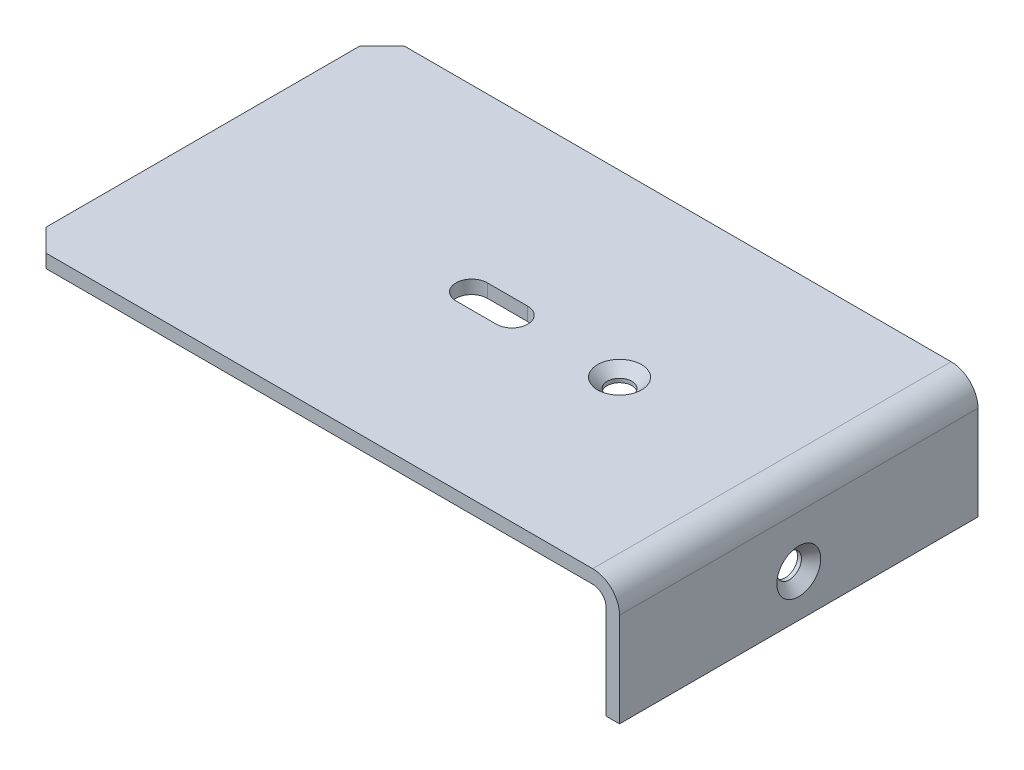
ISO-10303-21;
HEADER;
FILE_DESCRIPTION(('STEP AP214'),'2;1');
FILE_NAME('part.step','',(''),(''),'','','');
FILE_SCHEMA(('AUTOMOTIVE_DESIGN { 1 0 10303 214 1 1 1 1 }'));
ENDSEC;
DATA;
#1=APPLICATION_CONTEXT('core data for automotive mechanical design processes');
#2=APPLICATION_PROTOCOL_DEFINITION('international standard','automotive_design',2000,#1);
#3=PRODUCT_CONTEXT('',#1,'mechanical');
#4=PRODUCT('Part','Part','',(#3));
#5=PRODUCT_RELATED_PRODUCT_CATEGORY('part','',(#4));
#6=PRODUCT_DEFINITION_FORMATION('','',#4);
#7=PRODUCT_DEFINITION_CONTEXT('part definition',#1,'design');
#8=PRODUCT_DEFINITION('design','',#6,#7);
#9=PRODUCT_DEFINITION_SHAPE('','',#8);
#10=(LENGTH_UNIT() NAMED_UNIT(*) SI_UNIT(.MILLI.,.METRE.));
#11=(NAMED_UNIT(*) PLANE_ANGLE_UNIT() SI_UNIT($,.RADIAN.));
#12=(NAMED_UNIT(*) SI_UNIT($,.STERADIAN.) SOLID_ANGLE_UNIT());
#13=UNCERTAINTY_MEASURE_WITH_UNIT(LENGTH_MEASURE(1.E-05),#10,'distance_accuracy_value','');
#14=(GEOMETRIC_REPRESENTATION_CONTEXT(3) GLOBAL_UNCERTAINTY_ASSIGNED_CONTEXT((#13)) GLOBAL_UNIT_ASSIGNED_CONTEXT((#10,
#11,#12)) REPRESENTATION_CONTEXT('',''));
#15=CARTESIAN_POINT('',(0.,0.,0.));
#16=DIRECTION('',(0.,0.,1.));
#17=DIRECTION('',(1.,0.,0.));
#18=AXIS2_PLACEMENT_3D('',#15,#16,#17);
#19=CARTESIAN_POINT('',(0.,-3.00000000000002,40.));
#20=DIRECTION('',(1.,0.,0.));
#21=DIRECTION('',(0.,1.,0.));
#22=AXIS2_PLACEMENT_3D('',#19,#20,#21);
#23=PLANE('',#22);
#24=CARTESIAN_POINT('',(0.,-14.5,0.));
#25=DIRECTION('',(1.,0.,0.));
#26=DIRECTION('',(0.,1.,0.));
#27=AXIS2_PLACEMENT_3D('',#24,#25,#26);
#28=CIRCLE('',#27,2.75);
#29=CARTESIAN_POINT('',(0.,-11.75,0.));
#30=VERTEX_POINT('',#29);
#31=EDGE_CURVE('E253',#30,#30,#28,.T.);
#32=ORIENTED_EDGE('',*,*,#31,.T.);
#33=EDGE_LOOP('',(#32));
#34=FACE_BOUND('',#33,.T.);
#35=DIRECTION('',(0.,-1.,0.));
#36=VECTOR('',#35,1.);
#37=CARTESIAN_POINT('',(0.,-3.00000000000002,-40.));
#38=LINE('',#37,#36);
#39=CARTESIAN_POINT('',(0.,-3.00000000000002,-40.));
#40=VERTEX_POINT('',#39);
#41=CARTESIAN_POINT('',(0.,-24.,-40.));
#42=VERTEX_POINT('',#41);
#43=EDGE_CURVE('E164',#40,#42,#38,.T.);
#44=ORIENTED_EDGE('',*,*,#43,.T.);
#45=DIRECTION('',(0.,0.,-1.));
#46=VECTOR('',#45,1.);
#47=CARTESIAN_POINT('',(0.,-24.,40.));
#48=LINE('',#47,#46);
#49=CARTESIAN_POINT('',(0.,-24.,40.));
#50=VERTEX_POINT('',#49);
#51=EDGE_CURVE('E220',#50,#42,#48,.T.);
#52=ORIENTED_EDGE('',*,*,#51,.F.);
#53=DIRECTION('',(0.,-1.,0.));
#54=VECTOR('',#53,1.);
#55=CARTESIAN_POINT('',(0.,-3.00000000000002,40.));
#56=LINE('',#55,#54);
#57=CARTESIAN_POINT('',(0.,-3.00000000000002,40.));
#58=VERTEX_POINT('',#57);
#59=EDGE_CURVE('E167',#58,#50,#56,.T.);
#60=ORIENTED_EDGE('',*,*,#59,.F.);
#61=DIRECTION('',(0.,0.,-1.));
#62=VECTOR('',#61,1.);
#63=CARTESIAN_POINT('',(0.,-3.00000000000002,40.));
#64=LINE('',#63,#62);
#65=EDGE_CURVE('E185',#58,#40,#64,.T.);
#66=ORIENTED_EDGE('',*,*,#65,.T.);
#67=EDGE_LOOP('',(#44,#52,#60,#66));
#68=FACE_BOUND('',#67,.T.);
#69=ADVANCED_FACE('F37',(#34,#68),#23,.F.);
#70=CARTESIAN_POINT('',(3.,-24.,40.));
#71=DIRECTION('',(0.,-1.,0.));
#72=DIRECTION('',(0.,0.,-1.));
#73=AXIS2_PLACEMENT_3D('',#70,#71,#72);
#74=PLANE('',#73);
#75=DIRECTION('',(-1.,0.,0.));
#76=VECTOR('',#75,1.);
#77=CARTESIAN_POINT('',(3.,-24.,-40.));
#78=LINE('',#77,#76);
#79=CARTESIAN_POINT('',(3.,-24.,-40.));
#80=VERTEX_POINT('',#79);
#81=EDGE_CURVE('E188',#80,#42,#78,.T.);
#82=ORIENTED_EDGE('',*,*,#81,.F.);
#83=DIRECTION('',(0.,0.,-1.));
#84=VECTOR('',#83,1.);
#85=CARTESIAN_POINT('',(3.,-24.,40.));
#86=LINE('',#85,#84);
#87=CARTESIAN_POINT('',(3.,-24.,40.));
#88=VERTEX_POINT('',#87);
#89=EDGE_CURVE('E218',#88,#80,#86,.T.);
#90=ORIENTED_EDGE('',*,*,#89,.F.);
#91=DIRECTION('',(-1.,0.,0.));
#92=VECTOR('',#91,1.);
#93=CARTESIAN_POINT('',(3.,-24.,40.));
#94=LINE('',#93,#92);
#95=EDGE_CURVE('E169',#88,#50,#94,.T.);
#96=ORIENTED_EDGE('',*,*,#95,.T.);
#97=ORIENTED_EDGE('',*,*,#51,.T.);
#98=EDGE_LOOP('',(#82,#90,#96,#97));
#99=FACE_BOUND('',#98,.T.);
#100=ADVANCED_FACE('F274',(#99),#74,.T.);
#101=CARTESIAN_POINT('',(3.,-3.00000000000002,40.));
#102=DIRECTION('',(1.,0.,0.));
#103=DIRECTION('',(0.,1.,0.));
#104=AXIS2_PLACEMENT_3D('',#101,#102,#103);
#105=PLANE('',#104);
#106=CARTESIAN_POINT('',(3.,-14.5,0.));
#107=DIRECTION('',(1.,0.,0.));
#108=DIRECTION('',(0.,1.,0.));
#109=AXIS2_PLACEMENT_3D('',#106,#107,#108);
#110=CIRCLE('',#109,4.90000000000002);
#111=CARTESIAN_POINT('',(3.,-9.59999999999999,0.));
#112=VERTEX_POINT('',#111);
#113=EDGE_CURVE('E256',#112,#112,#110,.F.);
#114=ORIENTED_EDGE('',*,*,#113,.T.);
#115=EDGE_LOOP('',(#114));
#116=FACE_BOUND('',#115,.T.);
#117=DIRECTION('',(0.,-1.,0.));
#118=VECTOR('',#117,1.);
#119=CARTESIAN_POINT('',(3.,-3.00000000000002,-40.));
#120=LINE('',#119,#118);
#121=CARTESIAN_POINT('',(3.,-3.00000000000002,-40.));
#122=VERTEX_POINT('',#121);
#123=EDGE_CURVE('E191',#122,#80,#120,.T.);
#124=ORIENTED_EDGE('',*,*,#123,.F.);
#125=DIRECTION('',(0.,0.,-1.));
#126=VECTOR('',#125,1.);
#127=CARTESIAN_POINT('',(3.,-3.00000000000002,40.));
#128=LINE('',#127,#126);
#129=CARTESIAN_POINT('',(3.,-3.00000000000002,40.));
#130=VERTEX_POINT('',#129);
#131=EDGE_CURVE('E216',#130,#122,#128,.T.);
#132=ORIENTED_EDGE('',*,*,#131,.F.);
#133=DIRECTION('',(0.,-1.,0.));
#134=VECTOR('',#133,1.);
#135=CARTESIAN_POINT('',(3.,-3.00000000000002,40.));
#136=LINE('',#135,#134);
#137=EDGE_CURVE('E173',#130,#88,#136,.T.);
#138=ORIENTED_EDGE('',*,*,#137,.T.);
#139=ORIENTED_EDGE('',*,*,#89,.T.);
#140=EDGE_LOOP('',(#124,#132,#138,#139));
#141=FACE_BOUND('',#140,.T.);
#142=ADVANCED_FACE('F280',(#116,#141),#105,.T.);
#143=CARTESIAN_POINT('',(-3.,-3.,40.));
#144=DIRECTION('',(0.,0.,-1.));
#145=DIRECTION('',(-1.,0.,0.));
#146=AXIS2_PLACEMENT_3D('',#143,#144,#145);
#147=CYLINDRICAL_SURFACE('',#146,6.);
#148=CARTESIAN_POINT('',(-3.,-3.,-40.));
#149=DIRECTION('',(0.,0.,1.));
#150=DIRECTION('',(1.,0.,0.));
#151=AXIS2_PLACEMENT_3D('',#148,#149,#150);
#152=CIRCLE('',#151,6.);
#153=CARTESIAN_POINT('',(-3.00000000000004,3.,-40.));
#154=VERTEX_POINT('',#153);
#155=EDGE_CURVE('E194',#154,#122,#152,.F.);
#156=ORIENTED_EDGE('',*,*,#155,.F.);
#157=DIRECTION('',(0.,0.,-1.));
#158=VECTOR('',#157,1.);
#159=CARTESIAN_POINT('',(-3.00000000000004,3.,40.));
#160=LINE('',#159,#158);
#161=CARTESIAN_POINT('',(-3.00000000000004,3.,40.));
#162=VERTEX_POINT('',#161);
#163=EDGE_CURVE('E213',#162,#154,#160,.T.);
#164=ORIENTED_EDGE('',*,*,#163,.F.);
#165=CARTESIAN_POINT('',(-3.,-3.,40.));
#166=DIRECTION('',(0.,0.,1.));
#167=DIRECTION('',(1.,0.,0.));
#168=AXIS2_PLACEMENT_3D('',#165,#166,#167);
#169=CIRCLE('',#168,6.);
#170=EDGE_CURVE('E176',#162,#130,#169,.F.);
#171=ORIENTED_EDGE('',*,*,#170,.T.);
#172=ORIENTED_EDGE('',*,*,#131,.T.);
#173=EDGE_LOOP('',(#156,#164,#171,#172));
#174=FACE_BOUND('',#173,.T.);
#175=ADVANCED_FACE('F335',(#174),#147,.T.);
#176=CARTESIAN_POINT('',(-3.00000000000002,3.,40.));
#177=DIRECTION('',(0.,1.,0.));
#178=DIRECTION('',(-1.,0.,0.));
#179=AXIS2_PLACEMENT_3D('',#176,#177,#178);
#180=PLANE('',#179);
#181=CARTESIAN_POINT('',(-37.,3.,0.));
#182=DIRECTION('',(0.,1.,0.));
#183=DIRECTION('',(-1.,0.,0.));
#184=AXIS2_PLACEMENT_3D('',#181,#182,#183);
#185=CIRCLE('',#184,4.90000000000002);
#186=CARTESIAN_POINT('',(-41.9,2.99999999999999,0.));
#187=VERTEX_POINT('',#186);
#188=EDGE_CURVE('E11',#187,#187,#185,.F.);
#189=ORIENTED_EDGE('',*,*,#188,.T.);
#190=EDGE_LOOP('',(#189));
#191=FACE_BOUND('',#190,.T.);
#192=CARTESIAN_POINT('',(-70.,2.99999999999999,0.));
#193=DIRECTION('',(0.,1.,0.));
#194=DIRECTION('',(-1.,0.,0.));
#195=AXIS2_PLACEMENT_3D('',#192,#193,#194);
#196=CIRCLE('',#195,3.5);
#197=CARTESIAN_POINT('',(-70.,2.99999999999999,-3.50000000000003));
#198=VERTEX_POINT('',#197);
#199=CARTESIAN_POINT('',(-70.,2.99999999999999,3.49999999999998));
#200=VERTEX_POINT('',#199);
#201=EDGE_CURVE('E52',#198,#200,#196,.T.);
#202=ORIENTED_EDGE('',*,*,#201,.F.);
#203=DIRECTION('',(-1.,0.,0.));
#204=VECTOR('',#203,1.);
#205=CARTESIAN_POINT('',(-70.,2.99999999999999,-3.50000000000003));
#206=LINE('',#205,#204);
#207=CARTESIAN_POINT('',(-61.,2.99999999999999,-3.50000000000003));
#208=VERTEX_POINT('',#207);
#209=EDGE_CURVE('E157',#208,#198,#206,.T.);
#210=ORIENTED_EDGE('',*,*,#209,.F.);
#211=CARTESIAN_POINT('',(-61.,2.99999999999999,0.));
#212=DIRECTION('',(0.,1.,0.));
#213=DIRECTION('',(-1.,0.,0.));
#214=AXIS2_PLACEMENT_3D('',#211,#212,#213);
#215=CIRCLE('',#214,3.5);
#216=CARTESIAN_POINT('',(-61.,2.99999999999999,3.49999999999998));
#217=VERTEX_POINT('',#216);
#218=EDGE_CURVE('E141',#217,#208,#215,.T.);
#219=ORIENTED_EDGE('',*,*,#218,.F.);
#220=DIRECTION('',(1.,0.,0.));
#221=VECTOR('',#220,1.);
#222=CARTESIAN_POINT('',(-70.,2.99999999999999,3.49999999999998));
#223=LINE('',#222,#221);
#224=EDGE_CURVE('E150',#200,#217,#223,.T.);
#225=ORIENTED_EDGE('',*,*,#224,.F.);
#226=EDGE_LOOP('',(#202,#210,#219,#225));
#227=FACE_BOUND('',#226,.T.);
#228=DIRECTION('',(1.,0.,0.));
#229=VECTOR('',#228,1.);
#230=CARTESIAN_POINT('',(-3.00000000000002,3.,-40.));
#231=LINE('',#230,#229);
#232=CARTESIAN_POINT('',(-125.,2.99999999999998,-40.));
#233=VERTEX_POINT('',#232);
#234=EDGE_CURVE('E197',#233,#154,#231,.T.);
#235=ORIENTED_EDGE('',*,*,#234,.F.);
#236=DIRECTION('',(-0.707106781186544,0.,0.707106781186551));
#237=VECTOR('',#236,1.);
#238=CARTESIAN_POINT('',(-104.000000000001,2.99999999999999,-60.9999999999995));
#239=LINE('',#238,#237);
#240=CARTESIAN_POINT('',(-130.,2.99999999999998,-34.9999999999999));
#241=VERTEX_POINT('',#240);
#242=EDGE_CURVE('E227',#233,#241,#239,.T.);
#243=ORIENTED_EDGE('',*,*,#242,.T.);
#244=DIRECTION('',(0.,0.,-1.));
#245=VECTOR('',#244,1.);
#246=CARTESIAN_POINT('',(-130.,2.99999999999998,40.));
#247=LINE('',#246,#245);
#248=CARTESIAN_POINT('',(-130.,2.99999999999998,34.9999999999999));
#249=VERTEX_POINT('',#248);
#250=EDGE_CURVE('E210',#249,#241,#247,.T.);
#251=ORIENTED_EDGE('',*,*,#250,.F.);
#252=DIRECTION('',(-0.707106781186544,0.,-0.707106781186551));
#253=VECTOR('',#252,1.);
#254=CARTESIAN_POINT('',(-64.0000000000007,2.99999999999999,101.));
#255=LINE('',#254,#253);
#256=CARTESIAN_POINT('',(-125.,2.99999999999998,40.));
#257=VERTEX_POINT('',#256);
#258=EDGE_CURVE('E225',#249,#257,#255,.F.);
#259=ORIENTED_EDGE('',*,*,#258,.T.);
#260=DIRECTION('',(1.,0.,0.));
#261=VECTOR('',#260,1.);
#262=CARTESIAN_POINT('',(-3.00000000000002,3.,40.));
#263=LINE('',#262,#261);
#264=EDGE_CURVE('E179',#257,#162,#263,.T.);
#265=ORIENTED_EDGE('',*,*,#264,.T.);
#266=ORIENTED_EDGE('',*,*,#163,.T.);
#267=EDGE_LOOP('',(#235,#243,#251,#259,#265,#266));
#268=FACE_BOUND('',#267,.T.);
#269=ADVANCED_FACE('F154',(#191,#227,#268),#180,.T.);
#270=CARTESIAN_POINT('',(-130.,0.,40.));
#271=DIRECTION('',(-1.,0.,0.));
#272=DIRECTION('',(0.,0.,1.));
#273=AXIS2_PLACEMENT_3D('',#270,#271,#272);
#274=PLANE('',#273);
#275=ORIENTED_EDGE('',*,*,#250,.T.);
#276=DIRECTION('',(0.,-1.,0.));
#277=VECTOR('',#276,1.);
#278=CARTESIAN_POINT('',(-130.,0.,-34.9999999999999));
#279=LINE('',#278,#277);
#280=CARTESIAN_POINT('',(-130.,0.,-34.9999999999999));
#281=VERTEX_POINT('',#280);
#282=EDGE_CURVE('E232',#241,#281,#279,.T.);
#283=ORIENTED_EDGE('',*,*,#282,.T.);
#284=DIRECTION('',(0.,0.,-1.));
#285=VECTOR('',#284,1.);
#286=CARTESIAN_POINT('',(-130.,0.,40.));
#287=LINE('',#286,#285);
#288=CARTESIAN_POINT('',(-130.,0.,34.9999999999999));
#289=VERTEX_POINT('',#288);
#290=EDGE_CURVE('E207',#289,#281,#287,.T.);
#291=ORIENTED_EDGE('',*,*,#290,.F.);
#292=DIRECTION('',(0.,1.,0.));
#293=VECTOR('',#292,1.);
#294=CARTESIAN_POINT('',(-130.,0.,34.9999999999999));
#295=LINE('',#294,#293);
#296=EDGE_CURVE('E229',#289,#249,#295,.T.);
#297=ORIENTED_EDGE('',*,*,#296,.T.);
#298=EDGE_LOOP('',(#275,#283,#291,#297));
#299=FACE_BOUND('',#298,.T.);
#300=ADVANCED_FACE('F311',(#299),#274,.T.);
#301=CARTESIAN_POINT('',(-3.00000000000002,0.,40.));
#302=DIRECTION('',(0.,1.,0.));
#303=DIRECTION('',(-1.,0.,0.));
#304=AXIS2_PLACEMENT_3D('',#301,#302,#303);
#305=PLANE('',#304);
#306=CARTESIAN_POINT('',(-37.,0.,0.));
#307=DIRECTION('',(0.,1.,0.));
#308=DIRECTION('',(-1.,0.,0.));
#309=AXIS2_PLACEMENT_3D('',#306,#307,#308);
#310=CIRCLE('',#309,2.75);
#311=CARTESIAN_POINT('',(-39.75,0.,0.));
#312=VERTEX_POINT('',#311);
#313=EDGE_CURVE('E250',#312,#312,#310,.T.);
#314=ORIENTED_EDGE('',*,*,#313,.T.);
#315=EDGE_LOOP('',(#314));
#316=FACE_BOUND('',#315,.T.);
#317=DIRECTION('',(-1.,0.,0.));
#318=VECTOR('',#317,1.);
#319=CARTESIAN_POINT('',(-3.00000000000003,0.,-3.50000000000003));
#320=LINE('',#319,#318);
#321=CARTESIAN_POINT('',(-61.,0.,-3.50000000000003));
#322=VERTEX_POINT('',#321);
#323=CARTESIAN_POINT('',(-70.,0.,-3.50000000000003));
#324=VERTEX_POINT('',#323);
#325=EDGE_CURVE('E243',#322,#324,#320,.T.);
#326=ORIENTED_EDGE('',*,*,#325,.T.);
#327=CARTESIAN_POINT('',(-70.,0.,0.));
#328=DIRECTION('',(0.,1.,0.));
#329=DIRECTION('',(-1.,0.,0.));
#330=AXIS2_PLACEMENT_3D('',#327,#328,#329);
#331=CIRCLE('',#330,3.5);
#332=CARTESIAN_POINT('',(-70.,0.,3.49999999999998));
#333=VERTEX_POINT('',#332);
#334=EDGE_CURVE('E246',#324,#333,#331,.T.);
#335=ORIENTED_EDGE('',*,*,#334,.T.);
#336=DIRECTION('',(1.,0.,0.));
#337=VECTOR('',#336,1.);
#338=CARTESIAN_POINT('',(-3.00000000000002,0.,3.49999999999998));
#339=LINE('',#338,#337);
#340=CARTESIAN_POINT('',(-61.,0.,3.49999999999998));
#341=VERTEX_POINT('',#340);
#342=EDGE_CURVE('E240',#333,#341,#339,.T.);
#343=ORIENTED_EDGE('',*,*,#342,.T.);
#344=CARTESIAN_POINT('',(-61.,0.,0.));
#345=DIRECTION('',(0.,1.,0.));
#346=DIRECTION('',(-1.,0.,0.));
#347=AXIS2_PLACEMENT_3D('',#344,#345,#346);
#348=CIRCLE('',#347,3.5);
#349=EDGE_CURVE('E144',#341,#322,#348,.T.);
#350=ORIENTED_EDGE('',*,*,#349,.T.);
#351=EDGE_LOOP('',(#326,#335,#343,#350));
#352=FACE_BOUND('',#351,.T.);
#353=ORIENTED_EDGE('',*,*,#290,.T.);
#354=DIRECTION('',(0.707106781186544,0.,-0.707106781186551));
#355=VECTOR('',#354,1.);
#356=CARTESIAN_POINT('',(-125.,0.,-40.));
#357=LINE('',#356,#355);
#358=CARTESIAN_POINT('',(-125.,0.,-40.));
#359=VERTEX_POINT('',#358);
#360=EDGE_CURVE('E236',#281,#359,#357,.T.);
#361=ORIENTED_EDGE('',*,*,#360,.T.);
#362=DIRECTION('',(1.,0.,0.));
#363=VECTOR('',#362,1.);
#364=CARTESIAN_POINT('',(-3.00000000000002,0.,-40.));
#365=LINE('',#364,#363);
#366=CARTESIAN_POINT('',(-3.00000000000002,0.,-40.));
#367=VERTEX_POINT('',#366);
#368=EDGE_CURVE('E199',#359,#367,#365,.T.);
#369=ORIENTED_EDGE('',*,*,#368,.T.);
#370=DIRECTION('',(0.,0.,-1.));
#371=VECTOR('',#370,1.);
#372=CARTESIAN_POINT('',(-3.00000000000002,0.,40.));
#373=LINE('',#372,#371);
#374=CARTESIAN_POINT('',(-3.00000000000002,0.,40.));
#375=VERTEX_POINT('',#374);
#376=EDGE_CURVE('E204',#375,#367,#373,.T.);
#377=ORIENTED_EDGE('',*,*,#376,.F.);
#378=DIRECTION('',(1.,0.,0.));
#379=VECTOR('',#378,1.);
#380=CARTESIAN_POINT('',(-3.00000000000002,0.,40.));
#381=LINE('',#380,#379);
#382=CARTESIAN_POINT('',(-125.,0.,40.));
#383=VERTEX_POINT('',#382);
#384=EDGE_CURVE('E181',#383,#375,#381,.T.);
#385=ORIENTED_EDGE('',*,*,#384,.F.);
#386=DIRECTION('',(0.707106781186544,0.,0.707106781186551));
#387=VECTOR('',#386,1.);
#388=CARTESIAN_POINT('',(-130.,0.,34.9999999999999));
#389=LINE('',#388,#387);
#390=EDGE_CURVE('E234',#383,#289,#389,.F.);
#391=ORIENTED_EDGE('',*,*,#390,.T.);
#392=EDGE_LOOP('',(#353,#361,#369,#377,#385,#391));
#393=FACE_BOUND('',#392,.T.);
#394=ADVANCED_FACE('F307',(#316,#352,#393),#305,.F.);
#395=CARTESIAN_POINT('',(-3.,-3.,40.));
#396=DIRECTION('',(0.,0.,-1.));
#397=DIRECTION('',(-1.,0.,0.));
#398=AXIS2_PLACEMENT_3D('',#395,#396,#397);
#399=CYLINDRICAL_SURFACE('',#398,3.);
#400=CARTESIAN_POINT('',(-3.,-3.,-40.));
#401=DIRECTION('',(0.,0.,-1.));
#402=DIRECTION('',(1.,0.,0.));
#403=AXIS2_PLACEMENT_3D('',#400,#401,#402);
#404=CIRCLE('',#403,3.);
#405=EDGE_CURVE('E170',#367,#40,#404,.T.);
#406=ORIENTED_EDGE('',*,*,#405,.T.);
#407=ORIENTED_EDGE('',*,*,#65,.F.);
#408=CARTESIAN_POINT('',(-3.,-3.,40.));
#409=DIRECTION('',(0.,0.,-1.));
#410=DIRECTION('',(1.,0.,0.));
#411=AXIS2_PLACEMENT_3D('',#408,#409,#410);
#412=CIRCLE('',#411,3.);
#413=EDGE_CURVE('E183',#375,#58,#412,.T.);
#414=ORIENTED_EDGE('',*,*,#413,.F.);
#415=ORIENTED_EDGE('',*,*,#376,.T.);
#416=EDGE_LOOP('',(#406,#407,#414,#415));
#417=FACE_BOUND('',#416,.T.);
#418=ADVANCED_FACE('F322',(#417),#399,.F.);
#419=CARTESIAN_POINT('',(-3.,-3.,40.));
#420=DIRECTION('',(0.,0.,1.));
#421=DIRECTION('',(1.,0.,0.));
#422=AXIS2_PLACEMENT_3D('',#419,#420,#421);
#423=PLANE('',#422);
#424=ORIENTED_EDGE('',*,*,#264,.F.);
#425=DIRECTION('',(0.,-1.,0.));
#426=VECTOR('',#425,1.);
#427=CARTESIAN_POINT('',(-125.,-3.,40.));
#428=LINE('',#427,#426);
#429=EDGE_CURVE('E238',#257,#383,#428,.T.);
#430=ORIENTED_EDGE('',*,*,#429,.T.);
#431=ORIENTED_EDGE('',*,*,#384,.T.);
#432=ORIENTED_EDGE('',*,*,#413,.T.);
#433=ORIENTED_EDGE('',*,*,#59,.T.);
#434=ORIENTED_EDGE('',*,*,#95,.F.);
#435=ORIENTED_EDGE('',*,*,#137,.F.);
#436=ORIENTED_EDGE('',*,*,#170,.F.);
#437=EDGE_LOOP('',(#424,#430,#431,#432,#433,#434,#435,#436));
#438=FACE_BOUND('',#437,.T.);
#439=ADVANCED_FACE('F329',(#438),#423,.T.);
#440=CARTESIAN_POINT('',(-3.,-3.,-40.));
#441=DIRECTION('',(0.,0.,1.));
#442=DIRECTION('',(1.,0.,0.));
#443=AXIS2_PLACEMENT_3D('',#440,#441,#442);
#444=PLANE('',#443);
#445=ORIENTED_EDGE('',*,*,#368,.F.);
#446=DIRECTION('',(0.,1.,0.));
#447=VECTOR('',#446,1.);
#448=CARTESIAN_POINT('',(-125.,2.99999999999998,-40.));
#449=LINE('',#448,#447);
#450=EDGE_CURVE('E222',#359,#233,#449,.T.);
#451=ORIENTED_EDGE('',*,*,#450,.T.);
#452=ORIENTED_EDGE('',*,*,#234,.T.);
#453=ORIENTED_EDGE('',*,*,#155,.T.);
#454=ORIENTED_EDGE('',*,*,#123,.T.);
#455=ORIENTED_EDGE('',*,*,#81,.T.);
#456=ORIENTED_EDGE('',*,*,#43,.F.);
#457=ORIENTED_EDGE('',*,*,#405,.F.);
#458=EDGE_LOOP('',(#445,#451,#452,#453,#454,#455,#456,#457));
#459=FACE_BOUND('',#458,.T.);
#460=ADVANCED_FACE('F291',(#459),#444,.F.);
#461=CARTESIAN_POINT('',(-125.,-3.,-40.));
#462=DIRECTION('',(-0.707106781186551,0.,-0.707106781186544));
#463=DIRECTION('',(-0.707106781186544,0.,0.707106781186551));
#464=AXIS2_PLACEMENT_3D('',#461,#462,#463);
#465=PLANE('',#464);
#466=ORIENTED_EDGE('',*,*,#360,.F.);
#467=ORIENTED_EDGE('',*,*,#282,.F.);
#468=ORIENTED_EDGE('',*,*,#242,.F.);
#469=ORIENTED_EDGE('',*,*,#450,.F.);
#470=EDGE_LOOP('',(#466,#467,#468,#469));
#471=FACE_BOUND('',#470,.T.);
#472=ADVANCED_FACE('F287',(#471),#465,.T.);
#473=CARTESIAN_POINT('',(-130.,0.,34.9999999999999));
#474=DIRECTION('',(0.707106781186551,0.,-0.707106781186544));
#475=DIRECTION('',(-0.707106781186544,0.,-0.707106781186551));
#476=AXIS2_PLACEMENT_3D('',#473,#474,#475);
#477=PLANE('',#476);
#478=ORIENTED_EDGE('',*,*,#390,.F.);
#479=ORIENTED_EDGE('',*,*,#429,.F.);
#480=ORIENTED_EDGE('',*,*,#258,.F.);
#481=ORIENTED_EDGE('',*,*,#296,.F.);
#482=EDGE_LOOP('',(#478,#479,#480,#481));
#483=FACE_BOUND('',#482,.T.);
#484=ADVANCED_FACE('F290',(#483),#477,.F.);
#485=CARTESIAN_POINT('',(-70.,-24.,0.));
#486=DIRECTION('',(0.,1.,0.));
#487=DIRECTION('',(-1.,0.,0.));
#488=AXIS2_PLACEMENT_3D('',#485,#486,#487);
#489=CYLINDRICAL_SURFACE('',#488,3.5);
#490=DIRECTION('',(0.,1.,0.));
#491=VECTOR('',#490,1.);
#492=CARTESIAN_POINT('',(-70.,-24.,-3.50000000000003));
#493=LINE('',#492,#491);
#494=EDGE_CURVE('E162',#324,#198,#493,.T.);
#495=ORIENTED_EDGE('',*,*,#494,.T.);
#496=ORIENTED_EDGE('',*,*,#201,.T.);
#497=DIRECTION('',(0.,1.,0.));
#498=VECTOR('',#497,1.);
#499=CARTESIAN_POINT('',(-70.,-24.,3.49999999999998));
#500=LINE('',#499,#498);
#501=EDGE_CURVE('E147',#333,#200,#500,.T.);
#502=ORIENTED_EDGE('',*,*,#501,.F.);
#503=ORIENTED_EDGE('',*,*,#334,.F.);
#504=EDGE_LOOP('',(#495,#496,#502,#503));
#505=FACE_BOUND('',#504,.T.);
#506=ADVANCED_FACE('F294',(#505),#489,.F.);
#507=CARTESIAN_POINT('',(-70.,-24.,-3.50000000000003));
#508=DIRECTION('',(0.,0.,-1.));
#509=DIRECTION('',(-1.,0.,0.));
#510=AXIS2_PLACEMENT_3D('',#507,#508,#509);
#511=PLANE('',#510);
#512=DIRECTION('',(0.,1.,0.));
#513=VECTOR('',#512,1.);
#514=CARTESIAN_POINT('',(-61.,-24.,-3.50000000000003));
#515=LINE('',#514,#513);
#516=EDGE_CURVE('E146',#322,#208,#515,.T.);
#517=ORIENTED_EDGE('',*,*,#516,.T.);
#518=ORIENTED_EDGE('',*,*,#209,.T.);
#519=ORIENTED_EDGE('',*,*,#494,.F.);
#520=ORIENTED_EDGE('',*,*,#325,.F.);
#521=EDGE_LOOP('',(#517,#518,#519,#520));
#522=FACE_BOUND('',#521,.T.);
#523=ADVANCED_FACE('F299',(#522),#511,.F.);
#524=CARTESIAN_POINT('',(-61.,-24.,0.));
#525=DIRECTION('',(0.,1.,0.));
#526=DIRECTION('',(-1.,0.,0.));
#527=AXIS2_PLACEMENT_3D('',#524,#525,#526);
#528=CYLINDRICAL_SURFACE('',#527,3.5);
#529=DIRECTION('',(0.,1.,0.));
#530=VECTOR('',#529,1.);
#531=CARTESIAN_POINT('',(-61.,-24.,3.49999999999998));
#532=LINE('',#531,#530);
#533=EDGE_CURVE('E60',#341,#217,#532,.T.);
#534=ORIENTED_EDGE('',*,*,#533,.T.);
#535=ORIENTED_EDGE('',*,*,#218,.T.);
#536=ORIENTED_EDGE('',*,*,#516,.F.);
#537=ORIENTED_EDGE('',*,*,#349,.F.);
#538=EDGE_LOOP('',(#534,#535,#536,#537));
#539=FACE_BOUND('',#538,.T.);
#540=ADVANCED_FACE('F138',(#539),#528,.F.);
#541=CARTESIAN_POINT('',(-70.,-24.,3.49999999999998));
#542=DIRECTION('',(0.,0.,1.));
#543=DIRECTION('',(1.,0.,0.));
#544=AXIS2_PLACEMENT_3D('',#541,#542,#543);
#545=PLANE('',#544);
#546=ORIENTED_EDGE('',*,*,#501,.T.);
#547=ORIENTED_EDGE('',*,*,#224,.T.);
#548=ORIENTED_EDGE('',*,*,#533,.F.);
#549=ORIENTED_EDGE('',*,*,#342,.F.);
#550=EDGE_LOOP('',(#546,#547,#548,#549));
#551=FACE_BOUND('',#550,.T.);
#552=ADVANCED_FACE('F151',(#551),#545,.F.);
#553=CARTESIAN_POINT('',(-37.,-24.,0.));
#554=DIRECTION('',(0.,1.,0.));
#555=DIRECTION('',(-1.,0.,0.));
#556=AXIS2_PLACEMENT_3D('',#553,#554,#555);
#557=CYLINDRICAL_SURFACE('',#556,2.75);
#558=CARTESIAN_POINT('',(-37.,0.849999999999962,0.));
#559=DIRECTION('',(0.,1.,0.));
#560=DIRECTION('',(0.,0.,1.));
#561=AXIS2_PLACEMENT_3D('',#558,#559,#560);
#562=CIRCLE('',#561,2.75);
#563=CARTESIAN_POINT('',(-37.,0.849999999999962,2.74999999999997));
#564=VERTEX_POINT('',#563);
#565=EDGE_CURVE('E45',#564,#564,#562,.T.);
#566=ORIENTED_EDGE('',*,*,#565,.T.);
#567=EDGE_LOOP('',(#566));
#568=FACE_BOUND('',#567,.T.);
#569=ORIENTED_EDGE('',*,*,#313,.F.);
#570=EDGE_LOOP('',(#569));
#571=FACE_BOUND('',#570,.T.);
#572=ADVANCED_FACE('F261',(#568,#571),#557,.F.);
#573=CARTESIAN_POINT('',(-130.,-14.5,0.));
#574=DIRECTION('',(1.,0.,0.));
#575=DIRECTION('',(0.,1.,0.));
#576=AXIS2_PLACEMENT_3D('',#573,#574,#575);
#577=CYLINDRICAL_SURFACE('',#576,2.75);
#578=CARTESIAN_POINT('',(0.849999999999962,-14.5,0.));
#579=DIRECTION('',(1.,0.,0.));
#580=DIRECTION('',(0.,0.,-1.));
#581=AXIS2_PLACEMENT_3D('',#578,#579,#580);
#582=CIRCLE('',#581,2.75);
#583=CARTESIAN_POINT('',(0.849999999999962,-14.5,-2.75000000000001));
#584=VERTEX_POINT('',#583);
#585=EDGE_CURVE('E249',#584,#584,#582,.T.);
#586=ORIENTED_EDGE('',*,*,#585,.T.);
#587=EDGE_LOOP('',(#586));
#588=FACE_BOUND('',#587,.T.);
#589=ORIENTED_EDGE('',*,*,#31,.F.);
#590=EDGE_LOOP('',(#589));
#591=FACE_BOUND('',#590,.T.);
#592=ADVANCED_FACE('F270',(#588,#591),#577,.F.);
#593=CARTESIAN_POINT('',(0.849999999999962,-14.5,0.));
#594=DIRECTION('',(1.,0.,0.));
#595=DIRECTION('',(0.,0.,-1.));
#596=AXIS2_PLACEMENT_3D('',#593,#594,#595);
#597=CONICAL_SURFACE('',#596,2.75,0.785398163397443);
#598=ORIENTED_EDGE('',*,*,#113,.F.);
#599=EDGE_LOOP('',(#598));
#600=FACE_BOUND('',#599,.T.);
#601=ORIENTED_EDGE('',*,*,#585,.F.);
#602=EDGE_LOOP('',(#601));
#603=FACE_BOUND('',#602,.T.);
#604=ADVANCED_FACE('F265',(#600,#603),#597,.F.);
#605=CARTESIAN_POINT('',(-37.,0.849999999999958,0.));
#606=DIRECTION('',(0.,1.,0.));
#607=DIRECTION('',(0.,0.,1.));
#608=AXIS2_PLACEMENT_3D('',#605,#606,#607);
#609=CONICAL_SURFACE('',#608,2.75,0.785398163397444);
#610=ORIENTED_EDGE('',*,*,#188,.F.);
#611=EDGE_LOOP('',(#610));
#612=FACE_BOUND('',#611,.T.);
#613=ORIENTED_EDGE('',*,*,#565,.F.);
#614=EDGE_LOOP('',(#613));
#615=FACE_BOUND('',#614,.T.);
#616=ADVANCED_FACE('F39',(#612,#615),#609,.F.);
#617=CLOSED_SHELL('',(#69,#100,#142,#175,#269,#300,#394,#418,#439,#460,#472,#484,#506,#523,#540,
#552,#572,#592,#604,#616));
#618=MANIFOLD_SOLID_BREP('B2',#617);
#619=ADVANCED_BREP_SHAPE_REPRESENTATION('',(#18,#618),#14);
#620=SHAPE_DEFINITION_REPRESENTATION(#9,#619);
ENDSEC;
END-ISO-10303-21;
